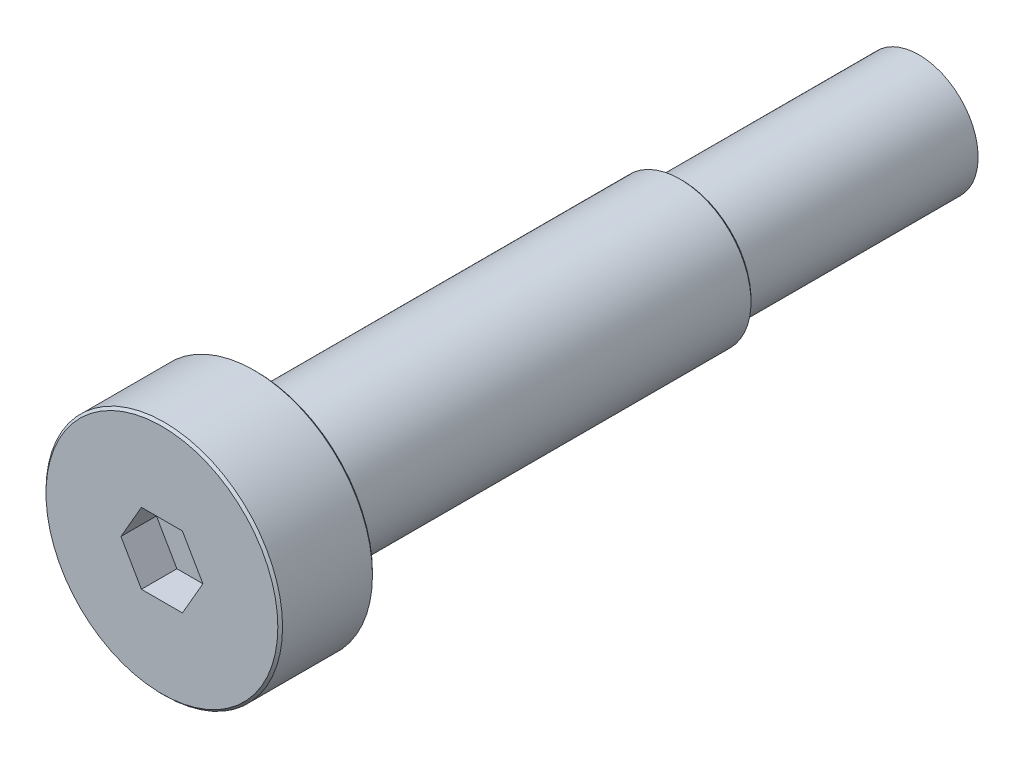
ISO-10303-21;
HEADER;
FILE_DESCRIPTION(('STEP AP214'),'2;1');
FILE_NAME('part.step','',(''),(''),'','','');
FILE_SCHEMA(('AUTOMOTIVE_DESIGN { 1 0 10303 214 1 1 1 1 }'));
ENDSEC;
DATA;
#1=APPLICATION_CONTEXT('core data for automotive mechanical design processes');
#2=APPLICATION_PROTOCOL_DEFINITION('international standard','automotive_design',2000,#1);
#3=PRODUCT_CONTEXT('',#1,'mechanical');
#4=PRODUCT('Part','Part','',(#3));
#5=PRODUCT_RELATED_PRODUCT_CATEGORY('part','',(#4));
#6=PRODUCT_DEFINITION_FORMATION('','',#4);
#7=PRODUCT_DEFINITION_CONTEXT('part definition',#1,'design');
#8=PRODUCT_DEFINITION('design','',#6,#7);
#9=PRODUCT_DEFINITION_SHAPE('','',#8);
#10=(LENGTH_UNIT() NAMED_UNIT(*) SI_UNIT(.MILLI.,.METRE.));
#11=(NAMED_UNIT(*) PLANE_ANGLE_UNIT() SI_UNIT($,.RADIAN.));
#12=(NAMED_UNIT(*) SI_UNIT($,.STERADIAN.) SOLID_ANGLE_UNIT());
#13=UNCERTAINTY_MEASURE_WITH_UNIT(LENGTH_MEASURE(1.E-05),#10,'distance_accuracy_value','');
#14=(GEOMETRIC_REPRESENTATION_CONTEXT(3) GLOBAL_UNCERTAINTY_ASSIGNED_CONTEXT((#13)) GLOBAL_UNIT_ASSIGNED_CONTEXT((#10,
#11,#12)) REPRESENTATION_CONTEXT('',''));
#15=CARTESIAN_POINT('',(0.,0.,0.));
#16=DIRECTION('',(0.,0.,1.));
#17=DIRECTION('',(1.,0.,0.));
#18=AXIS2_PLACEMENT_3D('',#15,#16,#17);
#19=CARTESIAN_POINT('',(0.,0.,-4.));
#20=DIRECTION('',(0.,0.,1.));
#21=DIRECTION('',(1.,0.,0.));
#22=AXIS2_PLACEMENT_3D('',#19,#20,#21);
#23=CYLINDRICAL_SURFACE('',#22,5.);
#24=CARTESIAN_POINT('',(0.,0.,-3.9));
#25=DIRECTION('',(0.,0.,1.));
#26=DIRECTION('',(1.,0.,0.));
#27=AXIS2_PLACEMENT_3D('',#24,#25,#26);
#28=CIRCLE('',#27,5.);
#29=CARTESIAN_POINT('',(5.,0.,-3.9));
#30=VERTEX_POINT('',#29);
#31=EDGE_CURVE('E167',#30,#30,#28,.T.);
#32=ORIENTED_EDGE('',*,*,#31,.T.);
#33=EDGE_LOOP('',(#32));
#34=FACE_BOUND('',#33,.T.);
#35=CARTESIAN_POINT('',(0.,0.,-0.100000000000002));
#36=DIRECTION('',(0.,0.,1.));
#37=DIRECTION('',(1.,0.,0.));
#38=AXIS2_PLACEMENT_3D('',#35,#36,#37);
#39=CIRCLE('',#38,5.);
#40=CARTESIAN_POINT('',(5.,0.,-0.100000000000002));
#41=VERTEX_POINT('',#40);
#42=EDGE_CURVE('E164',#41,#41,#39,.F.);
#43=ORIENTED_EDGE('',*,*,#42,.T.);
#44=EDGE_LOOP('',(#43));
#45=FACE_BOUND('',#44,.T.);
#46=ADVANCED_FACE('F41',(#34,#45),#23,.T.);
#47=CARTESIAN_POINT('',(0.,0.,-4.));
#48=DIRECTION('',(0.,0.,1.));
#49=DIRECTION('',(1.,0.,0.));
#50=AXIS2_PLACEMENT_3D('',#47,#48,#49);
#51=PLANE('',#50);
#52=CARTESIAN_POINT('',(0.,0.,-4.));
#53=DIRECTION('',(0.,0.,1.));
#54=DIRECTION('',(1.,0.,0.));
#55=AXIS2_PLACEMENT_3D('',#52,#53,#54);
#56=CIRCLE('',#55,4.9);
#57=CARTESIAN_POINT('',(4.9,0.,-4.));
#58=VERTEX_POINT('',#57);
#59=EDGE_CURVE('E50',#58,#58,#56,.F.);
#60=ORIENTED_EDGE('',*,*,#59,.T.);
#61=EDGE_LOOP('',(#60));
#62=FACE_BOUND('',#61,.T.);
#63=CARTESIAN_POINT('',(0.,0.,-4.));
#64=DIRECTION('',(0.,0.,-1.));
#65=DIRECTION('',(-1.,0.,0.));
#66=AXIS2_PLACEMENT_3D('',#63,#64,#65);
#67=CIRCLE('',#66,3.);
#68=CARTESIAN_POINT('',(-3.,0.,-4.));
#69=VERTEX_POINT('',#68);
#70=EDGE_CURVE('E152',#69,#69,#67,.T.);
#71=ORIENTED_EDGE('',*,*,#70,.F.);
#72=EDGE_LOOP('',(#71));
#73=FACE_BOUND('',#72,.T.);
#74=ADVANCED_FACE('F172',(#62,#73),#51,.F.);
#75=CARTESIAN_POINT('',(0.,0.,0.));
#76=DIRECTION('',(0.,0.,1.));
#77=DIRECTION('',(1.,0.,0.));
#78=AXIS2_PLACEMENT_3D('',#75,#76,#77);
#79=PLANE('',#78);
#80=DIRECTION('',(0.5,0.866025403784439,0.));
#81=VECTOR('',#80,1.);
#82=CARTESIAN_POINT('',(0.866025403784438,-1.5,0.));
#83=LINE('',#82,#81);
#84=CARTESIAN_POINT('',(0.866025403784438,-1.5,0.));
#85=VERTEX_POINT('',#84);
#86=CARTESIAN_POINT('',(1.73205080756888,0.,0.));
#87=VERTEX_POINT('',#86);
#88=EDGE_CURVE('E57',#85,#87,#83,.T.);
#89=ORIENTED_EDGE('',*,*,#88,.F.);
#90=DIRECTION('',(1.,0.,0.));
#91=VECTOR('',#90,1.);
#92=CARTESIAN_POINT('',(-0.86602540378444,-1.5,0.));
#93=LINE('',#92,#91);
#94=CARTESIAN_POINT('',(-0.86602540378444,-1.5,0.));
#95=VERTEX_POINT('',#94);
#96=EDGE_CURVE('E140',#95,#85,#93,.T.);
#97=ORIENTED_EDGE('',*,*,#96,.F.);
#98=DIRECTION('',(0.5,-0.866025403784439,0.));
#99=VECTOR('',#98,1.);
#100=CARTESIAN_POINT('',(-1.73205080756888,0.,0.));
#101=LINE('',#100,#99);
#102=CARTESIAN_POINT('',(-1.73205080756888,0.,0.));
#103=VERTEX_POINT('',#102);
#104=EDGE_CURVE('E138',#103,#95,#101,.T.);
#105=ORIENTED_EDGE('',*,*,#104,.F.);
#106=DIRECTION('',(-0.5,-0.866025403784438,0.));
#107=VECTOR('',#106,1.);
#108=CARTESIAN_POINT('',(-0.866025403784438,1.5,0.));
#109=LINE('',#108,#107);
#110=CARTESIAN_POINT('',(-0.866025403784438,1.5,0.));
#111=VERTEX_POINT('',#110);
#112=EDGE_CURVE('E105',#111,#103,#109,.T.);
#113=ORIENTED_EDGE('',*,*,#112,.F.);
#114=DIRECTION('',(-1.,0.,0.));
#115=VECTOR('',#114,1.);
#116=CARTESIAN_POINT('',(0.866025403784438,1.5,0.));
#117=LINE('',#116,#115);
#118=CARTESIAN_POINT('',(0.866025403784438,1.5,0.));
#119=VERTEX_POINT('',#118);
#120=EDGE_CURVE('E134',#119,#111,#117,.T.);
#121=ORIENTED_EDGE('',*,*,#120,.F.);
#122=DIRECTION('',(-0.5,0.866025403784439,0.));
#123=VECTOR('',#122,1.);
#124=CARTESIAN_POINT('',(1.73205080756888,0.,0.));
#125=LINE('',#124,#123);
#126=EDGE_CURVE('E131',#87,#119,#125,.T.);
#127=ORIENTED_EDGE('',*,*,#126,.F.);
#128=EDGE_LOOP('',(#89,#97,#105,#113,#121,#127));
#129=FACE_BOUND('',#128,.T.);
#130=CARTESIAN_POINT('',(0.,0.,0.));
#131=DIRECTION('',(0.,0.,1.));
#132=DIRECTION('',(1.,0.,0.));
#133=AXIS2_PLACEMENT_3D('',#130,#131,#132);
#134=CIRCLE('',#133,4.9);
#135=CARTESIAN_POINT('',(4.9,0.,0.));
#136=VERTEX_POINT('',#135);
#137=EDGE_CURVE('E11',#136,#136,#134,.T.);
#138=ORIENTED_EDGE('',*,*,#137,.T.);
#139=EDGE_LOOP('',(#138));
#140=FACE_BOUND('',#139,.T.);
#141=ADVANCED_FACE('F191',(#129,#140),#79,.T.);
#142=CARTESIAN_POINT('',(0.,0.,-22.));
#143=DIRECTION('',(0.,0.,1.));
#144=DIRECTION('',(1.,0.,0.));
#145=AXIS2_PLACEMENT_3D('',#142,#143,#144);
#146=CYLINDRICAL_SURFACE('',#145,3.);
#147=CARTESIAN_POINT('',(0.,0.,-21.9));
#148=DIRECTION('',(0.,0.,-1.));
#149=DIRECTION('',(-1.,0.,0.));
#150=AXIS2_PLACEMENT_3D('',#147,#148,#149);
#151=CIRCLE('',#150,3.);
#152=CARTESIAN_POINT('',(-3.,0.,-21.9));
#153=VERTEX_POINT('',#152);
#154=EDGE_CURVE('E161',#153,#153,#151,.F.);
#155=ORIENTED_EDGE('',*,*,#154,.T.);
#156=EDGE_LOOP('',(#155));
#157=FACE_BOUND('',#156,.T.);
#158=ORIENTED_EDGE('',*,*,#70,.T.);
#159=EDGE_LOOP('',(#158));
#160=FACE_BOUND('',#159,.T.);
#161=ADVANCED_FACE('F193',(#157,#160),#146,.T.);
#162=CARTESIAN_POINT('',(0.,0.,-22.));
#163=DIRECTION('',(0.,0.,-1.));
#164=DIRECTION('',(-1.,0.,0.));
#165=AXIS2_PLACEMENT_3D('',#162,#163,#164);
#166=PLANE('',#165);
#167=CARTESIAN_POINT('',(0.,0.,-22.));
#168=DIRECTION('',(0.,0.,-1.));
#169=DIRECTION('',(-1.,0.,0.));
#170=AXIS2_PLACEMENT_3D('',#167,#168,#169);
#171=CIRCLE('',#170,2.90000000000001);
#172=CARTESIAN_POINT('',(-2.90000000000001,0.,-22.));
#173=VERTEX_POINT('',#172);
#174=EDGE_CURVE('E156',#173,#173,#171,.T.);
#175=ORIENTED_EDGE('',*,*,#174,.T.);
#176=EDGE_LOOP('',(#175));
#177=FACE_BOUND('',#176,.T.);
#178=CARTESIAN_POINT('',(0.,0.,-22.));
#179=DIRECTION('',(0.,0.,-1.));
#180=DIRECTION('',(-1.,0.,0.));
#181=AXIS2_PLACEMENT_3D('',#178,#179,#180);
#182=CIRCLE('',#181,2.5);
#183=CARTESIAN_POINT('',(-2.5,0.,-22.));
#184=VERTEX_POINT('',#183);
#185=EDGE_CURVE('E153',#184,#184,#182,.T.);
#186=ORIENTED_EDGE('',*,*,#185,.F.);
#187=EDGE_LOOP('',(#186));
#188=FACE_BOUND('',#187,.T.);
#189=ADVANCED_FACE('F200',(#177,#188),#166,.T.);
#190=CARTESIAN_POINT('',(0.,0.,-32.));
#191=DIRECTION('',(0.,0.,1.));
#192=DIRECTION('',(1.,0.,0.));
#193=AXIS2_PLACEMENT_3D('',#190,#191,#192);
#194=CYLINDRICAL_SURFACE('',#193,2.5);
#195=CARTESIAN_POINT('',(0.,0.,-32.));
#196=DIRECTION('',(0.,0.,-1.));
#197=DIRECTION('',(-1.,0.,0.));
#198=AXIS2_PLACEMENT_3D('',#195,#196,#197);
#199=CIRCLE('',#198,2.5);
#200=CARTESIAN_POINT('',(-2.5,0.,-32.));
#201=VERTEX_POINT('',#200);
#202=EDGE_CURVE('E144',#201,#201,#199,.T.);
#203=ORIENTED_EDGE('',*,*,#202,.F.);
#204=EDGE_LOOP('',(#203));
#205=FACE_BOUND('',#204,.T.);
#206=ORIENTED_EDGE('',*,*,#185,.T.);
#207=EDGE_LOOP('',(#206));
#208=FACE_BOUND('',#207,.T.);
#209=ADVANCED_FACE('F219',(#205,#208),#194,.T.);
#210=CARTESIAN_POINT('',(0.,0.,-32.));
#211=DIRECTION('',(0.,0.,-1.));
#212=DIRECTION('',(-1.,0.,0.));
#213=AXIS2_PLACEMENT_3D('',#210,#211,#212);
#214=PLANE('',#213);
#215=ORIENTED_EDGE('',*,*,#202,.T.);
#216=EDGE_LOOP('',(#215));
#217=FACE_BOUND('',#216,.T.);
#218=ADVANCED_FACE('F210',(#217),#214,.T.);
#219=CARTESIAN_POINT('',(0.,0.,-22.));
#220=DIRECTION('',(0.,0.,1.));
#221=DIRECTION('',(1.,0.,0.));
#222=AXIS2_PLACEMENT_3D('',#219,#220,#221);
#223=CONICAL_SURFACE('',#222,2.90000000000001,0.78539816339744);
#224=ORIENTED_EDGE('',*,*,#154,.F.);
#225=EDGE_LOOP('',(#224));
#226=FACE_BOUND('',#225,.T.);
#227=ORIENTED_EDGE('',*,*,#174,.F.);
#228=EDGE_LOOP('',(#227));
#229=FACE_BOUND('',#228,.T.);
#230=ADVANCED_FACE('F178',(#226,#229),#223,.T.);
#231=CARTESIAN_POINT('',(0.,0.,-3.9));
#232=DIRECTION('',(0.,0.,1.));
#233=DIRECTION('',(1.,0.,0.));
#234=AXIS2_PLACEMENT_3D('',#231,#232,#233);
#235=CONICAL_SURFACE('',#234,5.,0.785398163397448);
#236=ORIENTED_EDGE('',*,*,#59,.F.);
#237=EDGE_LOOP('',(#236));
#238=FACE_BOUND('',#237,.T.);
#239=ORIENTED_EDGE('',*,*,#31,.F.);
#240=EDGE_LOOP('',(#239));
#241=FACE_BOUND('',#240,.T.);
#242=ADVANCED_FACE('F175',(#238,#241),#235,.T.);
#243=CARTESIAN_POINT('',(0.,0.,0.));
#244=DIRECTION('',(0.,0.,-1.));
#245=DIRECTION('',(-1.,0.,0.));
#246=AXIS2_PLACEMENT_3D('',#243,#244,#245);
#247=CONICAL_SURFACE('',#246,4.9,0.785398163397448);
#248=ORIENTED_EDGE('',*,*,#42,.F.);
#249=EDGE_LOOP('',(#248));
#250=FACE_BOUND('',#249,.T.);
#251=ORIENTED_EDGE('',*,*,#137,.F.);
#252=EDGE_LOOP('',(#251));
#253=FACE_BOUND('',#252,.T.);
#254=ADVANCED_FACE('F44',(#250,#253),#247,.T.);
#255=CARTESIAN_POINT('',(0.866025403784438,-1.5,-1.5));
#256=DIRECTION('',(0.866025403784439,-0.5,0.));
#257=DIRECTION('',(0.5,0.866025403784439,0.));
#258=AXIS2_PLACEMENT_3D('',#255,#256,#257);
#259=PLANE('',#258);
#260=ORIENTED_EDGE('',*,*,#88,.T.);
#261=DIRECTION('',(0.,0.,1.));
#262=VECTOR('',#261,1.);
#263=CARTESIAN_POINT('',(1.73205080756888,0.,-1.5));
#264=LINE('',#263,#262);
#265=CARTESIAN_POINT('',(1.73205080756888,0.,-1.5));
#266=VERTEX_POINT('',#265);
#267=EDGE_CURVE('E87',#266,#87,#264,.T.);
#268=ORIENTED_EDGE('',*,*,#267,.F.);
#269=DIRECTION('',(0.5,0.866025403784439,0.));
#270=VECTOR('',#269,1.);
#271=CARTESIAN_POINT('',(0.866025403784438,-1.5,-1.5));
#272=LINE('',#271,#270);
#273=CARTESIAN_POINT('',(0.866025403784438,-1.5,-1.5));
#274=VERTEX_POINT('',#273);
#275=EDGE_CURVE('E142',#274,#266,#272,.T.);
#276=ORIENTED_EDGE('',*,*,#275,.F.);
#277=DIRECTION('',(0.,0.,1.));
#278=VECTOR('',#277,1.);
#279=CARTESIAN_POINT('',(0.866025403784438,-1.5,-1.5));
#280=LINE('',#279,#278);
#281=EDGE_CURVE('E65',#274,#85,#280,.T.);
#282=ORIENTED_EDGE('',*,*,#281,.T.);
#283=EDGE_LOOP('',(#260,#268,#276,#282));
#284=FACE_BOUND('',#283,.T.);
#285=ADVANCED_FACE('F188',(#284),#259,.F.);
#286=CARTESIAN_POINT('',(-0.86602540378444,-1.5,-1.5));
#287=DIRECTION('',(0.,-1.,0.));
#288=DIRECTION('',(1.,0.,0.));
#289=AXIS2_PLACEMENT_3D('',#286,#287,#288);
#290=PLANE('',#289);
#291=ORIENTED_EDGE('',*,*,#96,.T.);
#292=ORIENTED_EDGE('',*,*,#281,.F.);
#293=DIRECTION('',(1.,0.,0.));
#294=VECTOR('',#293,1.);
#295=CARTESIAN_POINT('',(-0.86602540378444,-1.5,-1.5));
#296=LINE('',#295,#294);
#297=CARTESIAN_POINT('',(-0.86602540378444,-1.5,-1.5));
#298=VERTEX_POINT('',#297);
#299=EDGE_CURVE('E117',#298,#274,#296,.T.);
#300=ORIENTED_EDGE('',*,*,#299,.F.);
#301=DIRECTION('',(0.,0.,1.));
#302=VECTOR('',#301,1.);
#303=CARTESIAN_POINT('',(-0.86602540378444,-1.5,-1.5));
#304=LINE('',#303,#302);
#305=EDGE_CURVE('E109',#298,#95,#304,.T.);
#306=ORIENTED_EDGE('',*,*,#305,.T.);
#307=EDGE_LOOP('',(#291,#292,#300,#306));
#308=FACE_BOUND('',#307,.T.);
#309=ADVANCED_FACE('F240',(#308),#290,.F.);
#310=CARTESIAN_POINT('',(-1.73205080756888,0.,-1.5));
#311=DIRECTION('',(-0.866025403784439,-0.5,0.));
#312=DIRECTION('',(0.5,-0.866025403784439,0.));
#313=AXIS2_PLACEMENT_3D('',#310,#311,#312);
#314=PLANE('',#313);
#315=ORIENTED_EDGE('',*,*,#104,.T.);
#316=ORIENTED_EDGE('',*,*,#305,.F.);
#317=DIRECTION('',(0.5,-0.866025403784439,0.));
#318=VECTOR('',#317,1.);
#319=CARTESIAN_POINT('',(-1.73205080756888,0.,-1.5));
#320=LINE('',#319,#318);
#321=CARTESIAN_POINT('',(-1.73205080756888,0.,-1.5));
#322=VERTEX_POINT('',#321);
#323=EDGE_CURVE('E113',#322,#298,#320,.T.);
#324=ORIENTED_EDGE('',*,*,#323,.F.);
#325=DIRECTION('',(0.,0.,1.));
#326=VECTOR('',#325,1.);
#327=CARTESIAN_POINT('',(-1.73205080756888,0.,-1.5));
#328=LINE('',#327,#326);
#329=EDGE_CURVE('E98',#322,#103,#328,.T.);
#330=ORIENTED_EDGE('',*,*,#329,.T.);
#331=EDGE_LOOP('',(#315,#316,#324,#330));
#332=FACE_BOUND('',#331,.T.);
#333=ADVANCED_FACE('F114',(#332),#314,.F.);
#334=CARTESIAN_POINT('',(-0.866025403784438,1.5,-1.5));
#335=DIRECTION('',(-0.866025403784438,0.5,0.));
#336=DIRECTION('',(-0.5,-0.866025403784438,0.));
#337=AXIS2_PLACEMENT_3D('',#334,#335,#336);
#338=PLANE('',#337);
#339=ORIENTED_EDGE('',*,*,#112,.T.);
#340=ORIENTED_EDGE('',*,*,#329,.F.);
#341=DIRECTION('',(-0.5,-0.866025403784438,0.));
#342=VECTOR('',#341,1.);
#343=CARTESIAN_POINT('',(-0.866025403784438,1.5,-1.5));
#344=LINE('',#343,#342);
#345=CARTESIAN_POINT('',(-0.866025403784438,1.5,-1.5));
#346=VERTEX_POINT('',#345);
#347=EDGE_CURVE('E102',#346,#322,#344,.T.);
#348=ORIENTED_EDGE('',*,*,#347,.F.);
#349=DIRECTION('',(0.,0.,1.));
#350=VECTOR('',#349,1.);
#351=CARTESIAN_POINT('',(-0.866025403784438,1.5,-1.5));
#352=LINE('',#351,#350);
#353=EDGE_CURVE('E110',#346,#111,#352,.T.);
#354=ORIENTED_EDGE('',*,*,#353,.T.);
#355=EDGE_LOOP('',(#339,#340,#348,#354));
#356=FACE_BOUND('',#355,.T.);
#357=ADVANCED_FACE('F100',(#356),#338,.F.);
#358=CARTESIAN_POINT('',(0.866025403784438,1.5,-1.5));
#359=DIRECTION('',(0.,1.,0.));
#360=DIRECTION('',(0.,0.,1.));
#361=AXIS2_PLACEMENT_3D('',#358,#359,#360);
#362=PLANE('',#361);
#363=ORIENTED_EDGE('',*,*,#120,.T.);
#364=ORIENTED_EDGE('',*,*,#353,.F.);
#365=DIRECTION('',(-1.,0.,0.));
#366=VECTOR('',#365,1.);
#367=CARTESIAN_POINT('',(0.866025403784438,1.5,-1.5));
#368=LINE('',#367,#366);
#369=CARTESIAN_POINT('',(0.866025403784438,1.5,-1.5));
#370=VERTEX_POINT('',#369);
#371=EDGE_CURVE('E123',#370,#346,#368,.T.);
#372=ORIENTED_EDGE('',*,*,#371,.F.);
#373=DIRECTION('',(0.,0.,1.));
#374=VECTOR('',#373,1.);
#375=CARTESIAN_POINT('',(0.866025403784438,1.5,-1.5));
#376=LINE('',#375,#374);
#377=EDGE_CURVE('E147',#370,#119,#376,.T.);
#378=ORIENTED_EDGE('',*,*,#377,.T.);
#379=EDGE_LOOP('',(#363,#364,#372,#378));
#380=FACE_BOUND('',#379,.T.);
#381=ADVANCED_FACE('F244',(#380),#362,.F.);
#382=CARTESIAN_POINT('',(1.73205080756888,0.,-1.5));
#383=DIRECTION('',(0.866025403784439,0.5,0.));
#384=DIRECTION('',(-0.5,0.866025403784439,0.));
#385=AXIS2_PLACEMENT_3D('',#382,#383,#384);
#386=PLANE('',#385);
#387=ORIENTED_EDGE('',*,*,#126,.T.);
#388=ORIENTED_EDGE('',*,*,#377,.F.);
#389=DIRECTION('',(-0.5,0.866025403784439,0.));
#390=VECTOR('',#389,1.);
#391=CARTESIAN_POINT('',(1.73205080756888,0.,-1.5));
#392=LINE('',#391,#390);
#393=EDGE_CURVE('E125',#266,#370,#392,.T.);
#394=ORIENTED_EDGE('',*,*,#393,.F.);
#395=ORIENTED_EDGE('',*,*,#267,.T.);
#396=EDGE_LOOP('',(#387,#388,#394,#395));
#397=FACE_BOUND('',#396,.T.);
#398=ADVANCED_FACE('F241',(#397),#386,.F.);
#399=CARTESIAN_POINT('',(0.,0.,-1.5));
#400=DIRECTION('',(0.,0.,1.));
#401=DIRECTION('',(1.,0.,0.));
#402=AXIS2_PLACEMENT_3D('',#399,#400,#401);
#403=PLANE('',#402);
#404=ORIENTED_EDGE('',*,*,#275,.T.);
#405=ORIENTED_EDGE('',*,*,#393,.T.);
#406=ORIENTED_EDGE('',*,*,#371,.T.);
#407=ORIENTED_EDGE('',*,*,#347,.T.);
#408=ORIENTED_EDGE('',*,*,#323,.T.);
#409=ORIENTED_EDGE('',*,*,#299,.T.);
#410=EDGE_LOOP('',(#404,#405,#406,#407,#408,#409));
#411=FACE_BOUND('',#410,.T.);
#412=ADVANCED_FACE('F120',(#411),#403,.T.);
#413=CLOSED_SHELL('',(#46,#74,#141,#161,#189,#209,#218,#230,#242,#254,#285,#309,#333,#357,#381,
#398,#412));
#414=MANIFOLD_SOLID_BREP('B2',#413);
#415=ADVANCED_BREP_SHAPE_REPRESENTATION('',(#18,#414),#14);
#416=SHAPE_DEFINITION_REPRESENTATION(#9,#415);
ENDSEC;
END-ISO-10303-21;
